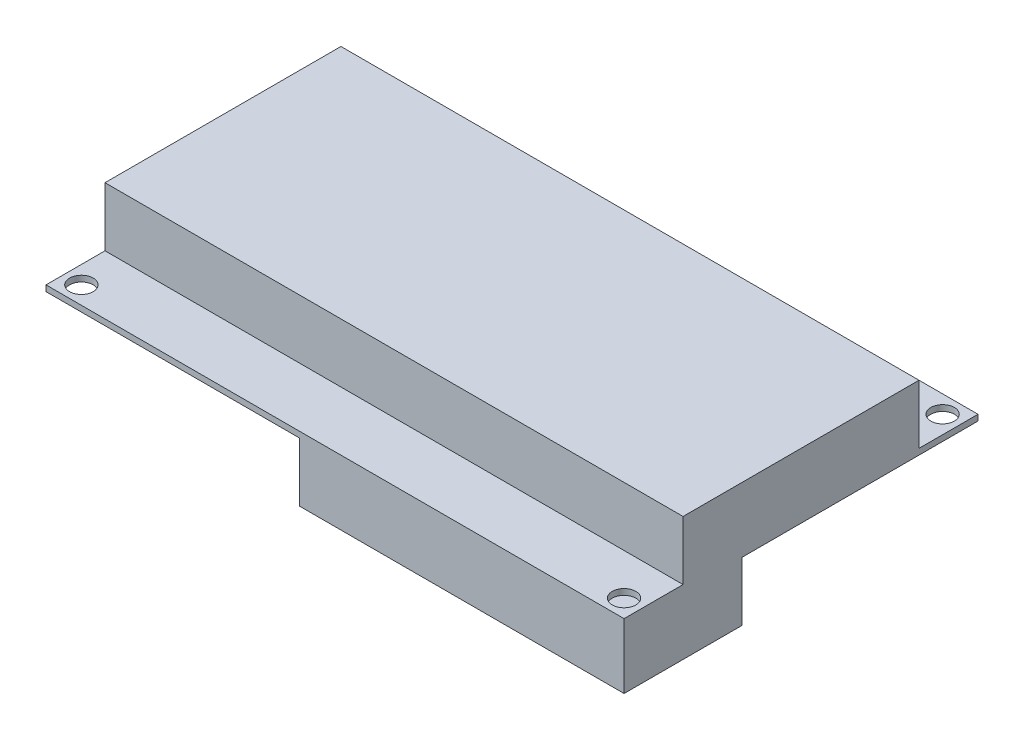
ISO-10303-21;
HEADER;
FILE_DESCRIPTION(('STEP AP214'),'2;1');
FILE_NAME('part.step','',(''),(''),'','','');
FILE_SCHEMA(('AUTOMOTIVE_DESIGN { 1 0 10303 214 1 1 1 1 }'));
ENDSEC;
DATA;
#1=APPLICATION_CONTEXT('core data for automotive mechanical design processes');
#2=APPLICATION_PROTOCOL_DEFINITION('international standard','automotive_design',2000,#1);
#3=PRODUCT_CONTEXT('',#1,'mechanical');
#4=PRODUCT('Part','Part','',(#3));
#5=PRODUCT_RELATED_PRODUCT_CATEGORY('part','',(#4));
#6=PRODUCT_DEFINITION_FORMATION('','',#4);
#7=PRODUCT_DEFINITION_CONTEXT('part definition',#1,'design');
#8=PRODUCT_DEFINITION('design','',#6,#7);
#9=PRODUCT_DEFINITION_SHAPE('','',#8);
#10=(LENGTH_UNIT() NAMED_UNIT(*) SI_UNIT(.MILLI.,.METRE.));
#11=(NAMED_UNIT(*) PLANE_ANGLE_UNIT() SI_UNIT($,.RADIAN.));
#12=(NAMED_UNIT(*) SI_UNIT($,.STERADIAN.) SOLID_ANGLE_UNIT());
#13=UNCERTAINTY_MEASURE_WITH_UNIT(LENGTH_MEASURE(1.E-05),#10,'distance_accuracy_value','');
#14=(GEOMETRIC_REPRESENTATION_CONTEXT(3) GLOBAL_UNCERTAINTY_ASSIGNED_CONTEXT((#13)) GLOBAL_UNIT_ASSIGNED_CONTEXT((#10,
#11,#12)) REPRESENTATION_CONTEXT('',''));
#15=CARTESIAN_POINT('',(0.,0.,0.));
#16=DIRECTION('',(0.,0.,1.));
#17=DIRECTION('',(1.,0.,0.));
#18=AXIS2_PLACEMENT_3D('',#15,#16,#17);
#19=CARTESIAN_POINT('',(0.,0.,0.));
#20=DIRECTION('',(0.,1.,0.));
#21=DIRECTION('',(0.,0.,1.));
#22=AXIS2_PLACEMENT_3D('',#19,#20,#21);
#23=PLANE('',#22);
#24=CARTESIAN_POINT('',(-46.,0.,-27.));
#25=DIRECTION('',(0.,1.,0.));
#26=DIRECTION('',(0.,0.,1.));
#27=AXIS2_PLACEMENT_3D('',#24,#25,#26);
#28=CIRCLE('',#27,2.);
#29=CARTESIAN_POINT('',(-46.,0.,-25.));
#30=VERTEX_POINT('',#29);
#31=EDGE_CURVE('E172',#30,#30,#28,.T.);
#32=ORIENTED_EDGE('',*,*,#31,.T.);
#33=EDGE_LOOP('',(#32));
#34=FACE_BOUND('',#33,.T.);
#35=CARTESIAN_POINT('',(-46.,0.,27.));
#36=DIRECTION('',(0.,1.,0.));
#37=DIRECTION('',(0.,0.,1.));
#38=AXIS2_PLACEMENT_3D('',#35,#36,#37);
#39=CIRCLE('',#38,2.);
#40=CARTESIAN_POINT('',(-46.,0.,29.));
#41=VERTEX_POINT('',#40);
#42=EDGE_CURVE('E168',#41,#41,#39,.F.);
#43=ORIENTED_EDGE('',*,*,#42,.F.);
#44=EDGE_LOOP('',(#43));
#45=FACE_BOUND('',#44,.T.);
#46=CARTESIAN_POINT('',(46.,0.,-27.));
#47=DIRECTION('',(0.,1.,0.));
#48=DIRECTION('',(0.,0.,1.));
#49=AXIS2_PLACEMENT_3D('',#46,#47,#48);
#50=CIRCLE('',#49,2.);
#51=CARTESIAN_POINT('',(46.,0.,-25.));
#52=VERTEX_POINT('',#51);
#53=EDGE_CURVE('E40',#52,#52,#50,.F.);
#54=ORIENTED_EDGE('',*,*,#53,.F.);
#55=EDGE_LOOP('',(#54));
#56=FACE_BOUND('',#55,.T.);
#57=DIRECTION('',(1.,0.,0.));
#58=VECTOR('',#57,1.);
#59=CARTESIAN_POINT('',(49.,0.,9.99999999999999));
#60=LINE('',#59,#58);
#61=CARTESIAN_POINT('',(-6.00000000000001,0.,9.99999999999999));
#62=VERTEX_POINT('',#61);
#63=CARTESIAN_POINT('',(49.,0.,10.));
#64=VERTEX_POINT('',#63);
#65=EDGE_CURVE('E145',#62,#64,#60,.T.);
#66=ORIENTED_EDGE('',*,*,#65,.F.);
#67=DIRECTION('',(0.,0.,-1.));
#68=VECTOR('',#67,1.);
#69=CARTESIAN_POINT('',(-6.00000000000001,0.,30.));
#70=LINE('',#69,#68);
#71=CARTESIAN_POINT('',(-6.00000000000001,0.,30.));
#72=VERTEX_POINT('',#71);
#73=EDGE_CURVE('E53',#72,#62,#70,.T.);
#74=ORIENTED_EDGE('',*,*,#73,.F.);
#75=DIRECTION('',(1.,0.,0.));
#76=VECTOR('',#75,1.);
#77=CARTESIAN_POINT('',(49.,0.,30.));
#78=LINE('',#77,#76);
#79=CARTESIAN_POINT('',(-49.,0.,30.));
#80=VERTEX_POINT('',#79);
#81=EDGE_CURVE('E212',#80,#72,#78,.T.);
#82=ORIENTED_EDGE('',*,*,#81,.F.);
#83=DIRECTION('',(0.,0.,1.));
#84=VECTOR('',#83,1.);
#85=CARTESIAN_POINT('',(-49.,0.,30.));
#86=LINE('',#85,#84);
#87=CARTESIAN_POINT('',(-49.,0.,-30.));
#88=VERTEX_POINT('',#87);
#89=EDGE_CURVE('E199',#88,#80,#86,.T.);
#90=ORIENTED_EDGE('',*,*,#89,.F.);
#91=DIRECTION('',(-1.,0.,0.));
#92=VECTOR('',#91,1.);
#93=CARTESIAN_POINT('',(49.,0.,-30.));
#94=LINE('',#93,#92);
#95=CARTESIAN_POINT('',(49.,0.,-30.));
#96=VERTEX_POINT('',#95);
#97=EDGE_CURVE('E215',#96,#88,#94,.T.);
#98=ORIENTED_EDGE('',*,*,#97,.F.);
#99=DIRECTION('',(0.,0.,-1.));
#100=VECTOR('',#99,1.);
#101=CARTESIAN_POINT('',(49.,0.,30.));
#102=LINE('',#101,#100);
#103=EDGE_CURVE('E59',#64,#96,#102,.T.);
#104=ORIENTED_EDGE('',*,*,#103,.F.);
#105=EDGE_LOOP('',(#66,#74,#82,#90,#98,#104));
#106=FACE_BOUND('',#105,.T.);
#107=ADVANCED_FACE('F36',(#34,#45,#56,#106),#23,.F.);
#108=CARTESIAN_POINT('',(0.,1.,0.));
#109=DIRECTION('',(0.,1.,0.));
#110=DIRECTION('',(0.,0.,1.));
#111=AXIS2_PLACEMENT_3D('',#108,#109,#110);
#112=PLANE('',#111);
#113=CARTESIAN_POINT('',(46.,1.,-27.));
#114=DIRECTION('',(0.,-1.,0.));
#115=DIRECTION('',(0.,0.,1.));
#116=AXIS2_PLACEMENT_3D('',#113,#114,#115);
#117=CIRCLE('',#116,2.);
#118=CARTESIAN_POINT('',(46.,1.,-25.));
#119=VERTEX_POINT('',#118);
#120=EDGE_CURVE('E158',#119,#119,#117,.T.);
#121=ORIENTED_EDGE('',*,*,#120,.T.);
#122=EDGE_LOOP('',(#121));
#123=FACE_BOUND('',#122,.T.);
#124=CARTESIAN_POINT('',(-46.,1.,-27.));
#125=DIRECTION('',(0.,1.,0.));
#126=DIRECTION('',(0.,0.,1.));
#127=AXIS2_PLACEMENT_3D('',#124,#125,#126);
#128=CIRCLE('',#127,2.);
#129=CARTESIAN_POINT('',(-46.,1.,-25.));
#130=VERTEX_POINT('',#129);
#131=EDGE_CURVE('E169',#130,#130,#128,.T.);
#132=ORIENTED_EDGE('',*,*,#131,.F.);
#133=EDGE_LOOP('',(#132));
#134=FACE_BOUND('',#133,.T.);
#135=DIRECTION('',(-1.,0.,0.));
#136=VECTOR('',#135,1.);
#137=CARTESIAN_POINT('',(49.,1.,-20.));
#138=LINE('',#137,#136);
#139=CARTESIAN_POINT('',(49.,1.,-20.));
#140=VERTEX_POINT('',#139);
#141=CARTESIAN_POINT('',(-49.,1.,-20.));
#142=VERTEX_POINT('',#141);
#143=EDGE_CURVE('E177',#140,#142,#138,.T.);
#144=ORIENTED_EDGE('',*,*,#143,.F.);
#145=DIRECTION('',(0.,0.,-1.));
#146=VECTOR('',#145,1.);
#147=CARTESIAN_POINT('',(49.,1.,30.));
#148=LINE('',#147,#146);
#149=CARTESIAN_POINT('',(49.,1.,-30.));
#150=VERTEX_POINT('',#149);
#151=EDGE_CURVE('E205',#140,#150,#148,.T.);
#152=ORIENTED_EDGE('',*,*,#151,.T.);
#153=DIRECTION('',(-1.,0.,0.));
#154=VECTOR('',#153,1.);
#155=CARTESIAN_POINT('',(49.,1.,-30.));
#156=LINE('',#155,#154);
#157=CARTESIAN_POINT('',(-49.,1.,-30.));
#158=VERTEX_POINT('',#157);
#159=EDGE_CURVE('E207',#150,#158,#156,.T.);
#160=ORIENTED_EDGE('',*,*,#159,.T.);
#161=DIRECTION('',(0.,0.,1.));
#162=VECTOR('',#161,1.);
#163=CARTESIAN_POINT('',(-49.,1.,30.));
#164=LINE('',#163,#162);
#165=EDGE_CURVE('E200',#158,#142,#164,.T.);
#166=ORIENTED_EDGE('',*,*,#165,.T.);
#167=EDGE_LOOP('',(#144,#152,#160,#166));
#168=FACE_BOUND('',#167,.T.);
#169=ADVANCED_FACE('F245',(#123,#134,#168),#112,.T.);
#170=CARTESIAN_POINT('',(-49.,1.,30.));
#171=DIRECTION('',(1.,0.,0.));
#172=DIRECTION('',(0.,0.,-1.));
#173=AXIS2_PLACEMENT_3D('',#170,#171,#172);
#174=PLANE('',#173);
#175=ORIENTED_EDGE('',*,*,#89,.T.);
#176=DIRECTION('',(0.,-1.,0.));
#177=VECTOR('',#176,1.);
#178=CARTESIAN_POINT('',(-49.,1.,30.));
#179=LINE('',#178,#177);
#180=CARTESIAN_POINT('',(-49.,1.,30.));
#181=VERTEX_POINT('',#180);
#182=EDGE_CURVE('E11',#181,#80,#179,.T.);
#183=ORIENTED_EDGE('',*,*,#182,.F.);
#184=CARTESIAN_POINT('',(-49.,1.,20.));
#185=VERTEX_POINT('',#184);
#186=EDGE_CURVE('E203',#185,#181,#164,.T.);
#187=ORIENTED_EDGE('',*,*,#186,.F.);
#188=DIRECTION('',(0.,-1.,0.));
#189=VECTOR('',#188,1.);
#190=CARTESIAN_POINT('',(-49.,11.,20.));
#191=LINE('',#190,#189);
#192=CARTESIAN_POINT('',(-49.,11.,20.));
#193=VERTEX_POINT('',#192);
#194=EDGE_CURVE('E196',#193,#185,#191,.T.);
#195=ORIENTED_EDGE('',*,*,#194,.F.);
#196=DIRECTION('',(0.,0.,1.));
#197=VECTOR('',#196,1.);
#198=CARTESIAN_POINT('',(-49.,11.,20.));
#199=LINE('',#198,#197);
#200=CARTESIAN_POINT('',(-49.,11.,-20.));
#201=VERTEX_POINT('',#200);
#202=EDGE_CURVE('E173',#201,#193,#199,.T.);
#203=ORIENTED_EDGE('',*,*,#202,.F.);
#204=DIRECTION('',(0.,-1.,0.));
#205=VECTOR('',#204,1.);
#206=CARTESIAN_POINT('',(-49.,11.,-20.));
#207=LINE('',#206,#205);
#208=EDGE_CURVE('E183',#201,#142,#207,.T.);
#209=ORIENTED_EDGE('',*,*,#208,.T.);
#210=ORIENTED_EDGE('',*,*,#165,.F.);
#211=DIRECTION('',(0.,-1.,0.));
#212=VECTOR('',#211,1.);
#213=CARTESIAN_POINT('',(-49.,1.,-30.));
#214=LINE('',#213,#212);
#215=EDGE_CURVE('E209',#158,#88,#214,.T.);
#216=ORIENTED_EDGE('',*,*,#215,.T.);
#217=EDGE_LOOP('',(#175,#183,#187,#195,#203,#209,#210,#216));
#218=FACE_BOUND('',#217,.T.);
#219=ADVANCED_FACE('F38',(#218),#174,.F.);
#220=CARTESIAN_POINT('',(49.,1.,30.));
#221=DIRECTION('',(0.,0.,-1.));
#222=DIRECTION('',(-1.,0.,0.));
#223=AXIS2_PLACEMENT_3D('',#220,#221,#222);
#224=PLANE('',#223);
#225=ORIENTED_EDGE('',*,*,#81,.T.);
#226=DIRECTION('',(0.,1.,0.));
#227=VECTOR('',#226,1.);
#228=CARTESIAN_POINT('',(-6.00000000000001,-10.,30.));
#229=LINE('',#228,#227);
#230=CARTESIAN_POINT('',(-6.00000000000001,-10.,30.));
#231=VERTEX_POINT('',#230);
#232=EDGE_CURVE('E136',#231,#72,#229,.T.);
#233=ORIENTED_EDGE('',*,*,#232,.F.);
#234=DIRECTION('',(-1.,0.,0.));
#235=VECTOR('',#234,1.);
#236=CARTESIAN_POINT('',(49.,-10.,30.));
#237=LINE('',#236,#235);
#238=CARTESIAN_POINT('',(49.,-10.,30.));
#239=VERTEX_POINT('',#238);
#240=EDGE_CURVE('E133',#239,#231,#237,.T.);
#241=ORIENTED_EDGE('',*,*,#240,.F.);
#242=DIRECTION('',(0.,-1.,0.));
#243=VECTOR('',#242,1.);
#244=CARTESIAN_POINT('',(49.,1.,30.));
#245=LINE('',#244,#243);
#246=CARTESIAN_POINT('',(49.,1.,30.));
#247=VERTEX_POINT('',#246);
#248=EDGE_CURVE('E45',#247,#239,#245,.T.);
#249=ORIENTED_EDGE('',*,*,#248,.F.);
#250=DIRECTION('',(1.,0.,0.));
#251=VECTOR('',#250,1.);
#252=CARTESIAN_POINT('',(49.,1.,30.));
#253=LINE('',#252,#251);
#254=EDGE_CURVE('E202',#181,#247,#253,.T.);
#255=ORIENTED_EDGE('',*,*,#254,.F.);
#256=ORIENTED_EDGE('',*,*,#182,.T.);
#257=EDGE_LOOP('',(#225,#233,#241,#249,#255,#256));
#258=FACE_BOUND('',#257,.T.);
#259=ADVANCED_FACE('F134',(#258),#224,.F.);
#260=CARTESIAN_POINT('',(49.,1.,30.));
#261=DIRECTION('',(-1.,0.,0.));
#262=DIRECTION('',(0.,0.,1.));
#263=AXIS2_PLACEMENT_3D('',#260,#261,#262);
#264=PLANE('',#263);
#265=ORIENTED_EDGE('',*,*,#248,.T.);
#266=DIRECTION('',(0.,0.,1.));
#267=VECTOR('',#266,1.);
#268=CARTESIAN_POINT('',(49.,-10.,30.));
#269=LINE('',#268,#267);
#270=CARTESIAN_POINT('',(49.,-10.,9.99999999999999));
#271=VERTEX_POINT('',#270);
#272=EDGE_CURVE('E125',#271,#239,#269,.T.);
#273=ORIENTED_EDGE('',*,*,#272,.F.);
#274=DIRECTION('',(0.,1.,0.));
#275=VECTOR('',#274,1.);
#276=CARTESIAN_POINT('',(49.,-10.,9.99999999999999));
#277=LINE('',#276,#275);
#278=EDGE_CURVE('E151',#271,#64,#277,.T.);
#279=ORIENTED_EDGE('',*,*,#278,.T.);
#280=ORIENTED_EDGE('',*,*,#103,.T.);
#281=DIRECTION('',(0.,-1.,0.));
#282=VECTOR('',#281,1.);
#283=CARTESIAN_POINT('',(49.,1.,-30.));
#284=LINE('',#283,#282);
#285=EDGE_CURVE('E130',#150,#96,#284,.T.);
#286=ORIENTED_EDGE('',*,*,#285,.F.);
#287=ORIENTED_EDGE('',*,*,#151,.F.);
#288=DIRECTION('',(0.,-1.,0.));
#289=VECTOR('',#288,1.);
#290=CARTESIAN_POINT('',(49.,11.,-20.));
#291=LINE('',#290,#289);
#292=CARTESIAN_POINT('',(49.,11.,-20.));
#293=VERTEX_POINT('',#292);
#294=EDGE_CURVE('E191',#293,#140,#291,.T.);
#295=ORIENTED_EDGE('',*,*,#294,.F.);
#296=DIRECTION('',(0.,0.,-1.));
#297=VECTOR('',#296,1.);
#298=CARTESIAN_POINT('',(49.,11.,20.));
#299=LINE('',#298,#297);
#300=CARTESIAN_POINT('',(49.,11.,20.));
#301=VERTEX_POINT('',#300);
#302=EDGE_CURVE('E179',#301,#293,#299,.T.);
#303=ORIENTED_EDGE('',*,*,#302,.F.);
#304=DIRECTION('',(0.,-1.,0.));
#305=VECTOR('',#304,1.);
#306=CARTESIAN_POINT('',(49.,11.,20.));
#307=LINE('',#306,#305);
#308=CARTESIAN_POINT('',(49.,1.,20.));
#309=VERTEX_POINT('',#308);
#310=EDGE_CURVE('E194',#301,#309,#307,.T.);
#311=ORIENTED_EDGE('',*,*,#310,.T.);
#312=EDGE_CURVE('E127',#247,#309,#148,.T.);
#313=ORIENTED_EDGE('',*,*,#312,.F.);
#314=EDGE_LOOP('',(#265,#273,#279,#280,#286,#287,#295,#303,#311,#313));
#315=FACE_BOUND('',#314,.T.);
#316=ADVANCED_FACE('F122',(#315),#264,.F.);
#317=CARTESIAN_POINT('',(49.,1.,-30.));
#318=DIRECTION('',(0.,0.,1.));
#319=DIRECTION('',(1.,0.,0.));
#320=AXIS2_PLACEMENT_3D('',#317,#318,#319);
#321=PLANE('',#320);
#322=ORIENTED_EDGE('',*,*,#97,.T.);
#323=ORIENTED_EDGE('',*,*,#215,.F.);
#324=ORIENTED_EDGE('',*,*,#159,.F.);
#325=ORIENTED_EDGE('',*,*,#285,.T.);
#326=EDGE_LOOP('',(#322,#323,#324,#325));
#327=FACE_BOUND('',#326,.T.);
#328=ADVANCED_FACE('F257',(#327),#321,.F.);
#329=CARTESIAN_POINT('',(46.,1.,27.));
#330=DIRECTION('',(0.,1.,0.));
#331=DIRECTION('',(0.,0.,-1.));
#332=AXIS2_PLACEMENT_3D('',#329,#330,#331);
#333=CIRCLE('',#332,2.);
#334=CARTESIAN_POINT('',(46.,1.,25.));
#335=VERTEX_POINT('',#334);
#336=EDGE_CURVE('E161',#335,#335,#333,.T.);
#337=ORIENTED_EDGE('',*,*,#336,.F.);
#338=EDGE_LOOP('',(#337));
#339=FACE_BOUND('',#338,.T.);
#340=CARTESIAN_POINT('',(-46.,1.,27.));
#341=DIRECTION('',(0.,-1.,0.));
#342=DIRECTION('',(0.,0.,-1.));
#343=AXIS2_PLACEMENT_3D('',#340,#341,#342);
#344=CIRCLE('',#343,2.);
#345=CARTESIAN_POINT('',(-46.,1.,25.));
#346=VERTEX_POINT('',#345);
#347=EDGE_CURVE('E165',#346,#346,#344,.T.);
#348=ORIENTED_EDGE('',*,*,#347,.T.);
#349=EDGE_LOOP('',(#348));
#350=FACE_BOUND('',#349,.T.);
#351=DIRECTION('',(1.,0.,0.));
#352=VECTOR('',#351,1.);
#353=CARTESIAN_POINT('',(49.,1.,20.));
#354=LINE('',#353,#352);
#355=EDGE_CURVE('E184',#185,#309,#354,.T.);
#356=ORIENTED_EDGE('',*,*,#355,.F.);
#357=ORIENTED_EDGE('',*,*,#186,.T.);
#358=ORIENTED_EDGE('',*,*,#254,.T.);
#359=ORIENTED_EDGE('',*,*,#312,.T.);
#360=EDGE_LOOP('',(#356,#357,#358,#359));
#361=FACE_BOUND('',#360,.T.);
#362=ADVANCED_FACE('F253',(#339,#350,#361),#112,.T.);
#363=CARTESIAN_POINT('',(49.,11.,20.));
#364=DIRECTION('',(0.,0.,-1.));
#365=DIRECTION('',(-1.,0.,0.));
#366=AXIS2_PLACEMENT_3D('',#363,#364,#365);
#367=PLANE('',#366);
#368=ORIENTED_EDGE('',*,*,#355,.T.);
#369=ORIENTED_EDGE('',*,*,#310,.F.);
#370=DIRECTION('',(1.,0.,0.));
#371=VECTOR('',#370,1.);
#372=CARTESIAN_POINT('',(49.,11.,20.));
#373=LINE('',#372,#371);
#374=EDGE_CURVE('E176',#193,#301,#373,.T.);
#375=ORIENTED_EDGE('',*,*,#374,.F.);
#376=ORIENTED_EDGE('',*,*,#194,.T.);
#377=EDGE_LOOP('',(#368,#369,#375,#376));
#378=FACE_BOUND('',#377,.T.);
#379=ADVANCED_FACE('F278',(#378),#367,.F.);
#380=CARTESIAN_POINT('',(49.,11.,-20.));
#381=DIRECTION('',(0.,0.,1.));
#382=DIRECTION('',(1.,0.,0.));
#383=AXIS2_PLACEMENT_3D('',#380,#381,#382);
#384=PLANE('',#383);
#385=ORIENTED_EDGE('',*,*,#143,.T.);
#386=ORIENTED_EDGE('',*,*,#208,.F.);
#387=DIRECTION('',(-1.,0.,0.));
#388=VECTOR('',#387,1.);
#389=CARTESIAN_POINT('',(49.,11.,-20.));
#390=LINE('',#389,#388);
#391=EDGE_CURVE('E181',#293,#201,#390,.T.);
#392=ORIENTED_EDGE('',*,*,#391,.F.);
#393=ORIENTED_EDGE('',*,*,#294,.T.);
#394=EDGE_LOOP('',(#385,#386,#392,#393));
#395=FACE_BOUND('',#394,.T.);
#396=ADVANCED_FACE('F286',(#395),#384,.F.);
#397=CARTESIAN_POINT('',(0.,11.,0.));
#398=DIRECTION('',(0.,1.,0.));
#399=DIRECTION('',(0.,0.,1.));
#400=AXIS2_PLACEMENT_3D('',#397,#398,#399);
#401=PLANE('',#400);
#402=ORIENTED_EDGE('',*,*,#202,.T.);
#403=ORIENTED_EDGE('',*,*,#374,.T.);
#404=ORIENTED_EDGE('',*,*,#302,.T.);
#405=ORIENTED_EDGE('',*,*,#391,.T.);
#406=EDGE_LOOP('',(#402,#403,#404,#405));
#407=FACE_BOUND('',#406,.T.);
#408=ADVANCED_FACE('F282',(#407),#401,.T.);
#409=CARTESIAN_POINT('',(-46.,-9.,-27.));
#410=DIRECTION('',(0.,1.,0.));
#411=DIRECTION('',(0.,0.,1.));
#412=AXIS2_PLACEMENT_3D('',#409,#410,#411);
#413=CYLINDRICAL_SURFACE('',#412,2.);
#414=ORIENTED_EDGE('',*,*,#131,.T.);
#415=EDGE_LOOP('',(#414));
#416=FACE_BOUND('',#415,.T.);
#417=ORIENTED_EDGE('',*,*,#31,.F.);
#418=EDGE_LOOP('',(#417));
#419=FACE_BOUND('',#418,.T.);
#420=ADVANCED_FACE('F241',(#416,#419),#413,.F.);
#421=CARTESIAN_POINT('',(-46.,-9.,27.));
#422=DIRECTION('',(0.,1.,0.));
#423=DIRECTION('',(0.,0.,1.));
#424=AXIS2_PLACEMENT_3D('',#421,#422,#423);
#425=CYLINDRICAL_SURFACE('',#424,2.);
#426=ORIENTED_EDGE('',*,*,#347,.F.);
#427=EDGE_LOOP('',(#426));
#428=FACE_BOUND('',#427,.T.);
#429=ORIENTED_EDGE('',*,*,#42,.T.);
#430=EDGE_LOOP('',(#429));
#431=FACE_BOUND('',#430,.T.);
#432=ADVANCED_FACE('F232',(#428,#431),#425,.F.);
#433=CARTESIAN_POINT('',(46.,-9.,27.));
#434=DIRECTION('',(0.,1.,0.));
#435=DIRECTION('',(0.,0.,1.));
#436=AXIS2_PLACEMENT_3D('',#433,#434,#435);
#437=CYLINDRICAL_SURFACE('',#436,2.);
#438=ORIENTED_EDGE('',*,*,#336,.T.);
#439=EDGE_LOOP('',(#438));
#440=FACE_BOUND('',#439,.T.);
#441=CARTESIAN_POINT('',(46.,0.,27.));
#442=DIRECTION('',(0.,1.,0.));
#443=DIRECTION('',(0.,0.,1.));
#444=AXIS2_PLACEMENT_3D('',#441,#442,#443);
#445=CIRCLE('',#444,2.);
#446=CARTESIAN_POINT('',(46.,0.,29.));
#447=VERTEX_POINT('',#446);
#448=EDGE_CURVE('E164',#447,#447,#445,.T.);
#449=ORIENTED_EDGE('',*,*,#448,.F.);
#450=EDGE_LOOP('',(#449));
#451=FACE_BOUND('',#450,.T.);
#452=ADVANCED_FACE('F229',(#440,#451),#437,.F.);
#453=CARTESIAN_POINT('',(46.,-9.,-27.));
#454=DIRECTION('',(0.,1.,0.));
#455=DIRECTION('',(0.,0.,1.));
#456=AXIS2_PLACEMENT_3D('',#453,#454,#455);
#457=CYLINDRICAL_SURFACE('',#456,2.);
#458=ORIENTED_EDGE('',*,*,#120,.F.);
#459=EDGE_LOOP('',(#458));
#460=FACE_BOUND('',#459,.T.);
#461=ORIENTED_EDGE('',*,*,#53,.T.);
#462=EDGE_LOOP('',(#461));
#463=FACE_BOUND('',#462,.T.);
#464=ADVANCED_FACE('F231',(#460,#463),#457,.F.);
#465=CARTESIAN_POINT('',(0.,-10.,0.));
#466=DIRECTION('',(0.,1.,0.));
#467=DIRECTION('',(0.,0.,1.));
#468=AXIS2_PLACEMENT_3D('',#465,#466,#467);
#469=PLANE('',#468);
#470=ORIENTED_EDGE('',*,*,#272,.T.);
#471=ORIENTED_EDGE('',*,*,#240,.T.);
#472=DIRECTION('',(0.,0.,-1.));
#473=VECTOR('',#472,1.);
#474=CARTESIAN_POINT('',(-6.00000000000001,-10.,30.));
#475=LINE('',#474,#473);
#476=CARTESIAN_POINT('',(-6.00000000000001,-10.,9.99999999999999));
#477=VERTEX_POINT('',#476);
#478=EDGE_CURVE('E139',#231,#477,#475,.T.);
#479=ORIENTED_EDGE('',*,*,#478,.T.);
#480=DIRECTION('',(1.,0.,0.));
#481=VECTOR('',#480,1.);
#482=CARTESIAN_POINT('',(49.,-10.,9.99999999999999));
#483=LINE('',#482,#481);
#484=EDGE_CURVE('E143',#477,#271,#483,.T.);
#485=ORIENTED_EDGE('',*,*,#484,.T.);
#486=EDGE_LOOP('',(#470,#471,#479,#485));
#487=FACE_BOUND('',#486,.T.);
#488=ADVANCED_FACE('F141',(#487),#469,.F.);
#489=CARTESIAN_POINT('',(49.,-10.,9.99999999999999));
#490=DIRECTION('',(0.,0.,1.));
#491=DIRECTION('',(1.,0.,0.));
#492=AXIS2_PLACEMENT_3D('',#489,#490,#491);
#493=PLANE('',#492);
#494=ORIENTED_EDGE('',*,*,#65,.T.);
#495=ORIENTED_EDGE('',*,*,#278,.F.);
#496=ORIENTED_EDGE('',*,*,#484,.F.);
#497=DIRECTION('',(0.,1.,0.));
#498=VECTOR('',#497,1.);
#499=CARTESIAN_POINT('',(-6.00000000000001,-10.,9.99999999999999));
#500=LINE('',#499,#498);
#501=EDGE_CURVE('E154',#477,#62,#500,.T.);
#502=ORIENTED_EDGE('',*,*,#501,.T.);
#503=EDGE_LOOP('',(#494,#495,#496,#502));
#504=FACE_BOUND('',#503,.T.);
#505=ADVANCED_FACE('F293',(#504),#493,.F.);
#506=CARTESIAN_POINT('',(-6.00000000000001,-10.,30.));
#507=DIRECTION('',(1.,0.,0.));
#508=DIRECTION('',(0.,0.,-1.));
#509=AXIS2_PLACEMENT_3D('',#506,#507,#508);
#510=PLANE('',#509);
#511=ORIENTED_EDGE('',*,*,#73,.T.);
#512=ORIENTED_EDGE('',*,*,#501,.F.);
#513=ORIENTED_EDGE('',*,*,#478,.F.);
#514=ORIENTED_EDGE('',*,*,#232,.T.);
#515=EDGE_LOOP('',(#511,#512,#513,#514));
#516=FACE_BOUND('',#515,.T.);
#517=ADVANCED_FACE('F296',(#516),#510,.F.);
#518=CARTESIAN_POINT('',(0.,0.,0.));
#519=DIRECTION('',(0.,1.,0.));
#520=DIRECTION('',(0.,0.,1.));
#521=AXIS2_PLACEMENT_3D('',#518,#519,#520);
#522=PLANE('',#521);
#523=ORIENTED_EDGE('',*,*,#448,.T.);
#524=EDGE_LOOP('',(#523));
#525=FACE_BOUND('',#524,.T.);
#526=ADVANCED_FACE('F227',(#525),#522,.T.);
#527=CLOSED_SHELL('',(#107,#169,#219,#259,#316,#328,#362,#379,#396,#408,#420,#432,#452,#464,
#488,#505,#517,#526));
#528=MANIFOLD_SOLID_BREP('B2',#527);
#529=ADVANCED_BREP_SHAPE_REPRESENTATION('',(#18,#528),#14);
#530=SHAPE_DEFINITION_REPRESENTATION(#9,#529);
ENDSEC;
END-ISO-10303-21;
